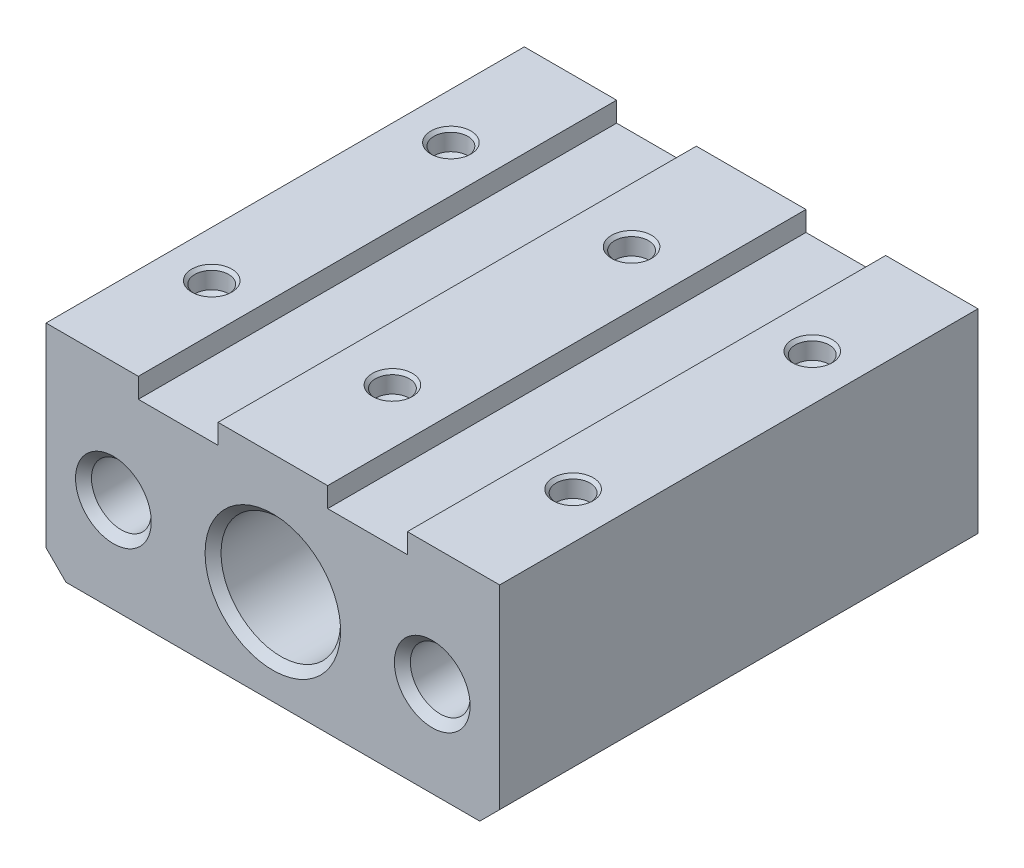
ISO-10303-21;
HEADER;
FILE_DESCRIPTION(('STEP AP214'),'2;1');
FILE_NAME('part.step','',(''),(''),'','','');
FILE_SCHEMA(('AUTOMOTIVE_DESIGN { 1 0 10303 214 1 1 1 1 }'));
ENDSEC;
DATA;
#1=APPLICATION_CONTEXT('core data for automotive mechanical design processes');
#2=APPLICATION_PROTOCOL_DEFINITION('international standard','automotive_design',2000,#1);
#3=PRODUCT_CONTEXT('',#1,'mechanical');
#4=PRODUCT('Part','Part','',(#3));
#5=PRODUCT_RELATED_PRODUCT_CATEGORY('part','',(#4));
#6=PRODUCT_DEFINITION_FORMATION('','',#4);
#7=PRODUCT_DEFINITION_CONTEXT('part definition',#1,'design');
#8=PRODUCT_DEFINITION('design','',#6,#7);
#9=PRODUCT_DEFINITION_SHAPE('','',#8);
#10=(LENGTH_UNIT() NAMED_UNIT(*) SI_UNIT(.MILLI.,.METRE.));
#11=(NAMED_UNIT(*) PLANE_ANGLE_UNIT() SI_UNIT($,.RADIAN.));
#12=(NAMED_UNIT(*) SI_UNIT($,.STERADIAN.) SOLID_ANGLE_UNIT());
#13=UNCERTAINTY_MEASURE_WITH_UNIT(LENGTH_MEASURE(1.E-05),#10,'distance_accuracy_value','');
#14=(GEOMETRIC_REPRESENTATION_CONTEXT(3) GLOBAL_UNCERTAINTY_ASSIGNED_CONTEXT((#13)) GLOBAL_UNIT_ASSIGNED_CONTEXT((#10,
#11,#12)) REPRESENTATION_CONTEXT('',''));
#15=CARTESIAN_POINT('',(0.,0.,0.));
#16=DIRECTION('',(0.,0.,1.));
#17=DIRECTION('',(1.,0.,0.));
#18=AXIS2_PLACEMENT_3D('',#15,#16,#17);
#19=CARTESIAN_POINT('',(56.9089514947405,63.8253093136275,-148.875816897944));
#20=DIRECTION('',(0.,1.,0.));
#21=DIRECTION('',(-1.,0.,0.));
#22=AXIS2_PLACEMENT_3D('',#19,#20,#21);
#23=PLANE('',#22);
#24=CARTESIAN_POINT('',(-45.3294757473701,63.8253093136275,-55.006350416644));
#25=DIRECTION('',(0.,1.,0.));
#26=DIRECTION('',(0.,0.,1.));
#27=AXIS2_PLACEMENT_3D('',#24,#25,#26);
#28=CIRCLE('',#27,5.025);
#29=CARTESIAN_POINT('',(-45.3294757473701,63.8253093136275,-49.981350416644));
#30=VERTEX_POINT('',#29);
#31=EDGE_CURVE('E181',#30,#30,#28,.T.);
#32=ORIENTED_EDGE('',*,*,#31,.F.);
#33=EDGE_LOOP('',(#32));
#34=FACE_BOUND('',#33,.T.);
#35=CARTESIAN_POINT('',(-45.3294757473701,63.8253093136275,4.99364958335603));
#36=DIRECTION('',(0.,1.,0.));
#37=DIRECTION('',(0.,0.,1.));
#38=AXIS2_PLACEMENT_3D('',#35,#36,#37);
#39=CIRCLE('',#38,5.025);
#40=CARTESIAN_POINT('',(-45.3294757473701,63.8253093136275,10.018649583356));
#41=VERTEX_POINT('',#40);
#42=EDGE_CURVE('E174',#41,#41,#39,.T.);
#43=ORIENTED_EDGE('',*,*,#42,.F.);
#44=EDGE_LOOP('',(#43));
#45=FACE_BOUND('',#44,.T.);
#46=DIRECTION('',(0.,0.,1.));
#47=VECTOR('',#46,1.);
#48=CARTESIAN_POINT('',(-33.7499999999997,63.8253093136275,-85.006350416644));
#49=LINE('',#48,#47);
#50=CARTESIAN_POINT('',(-33.7499999999997,63.8253093136275,-85.006350416644));
#51=VERTEX_POINT('',#50);
#52=CARTESIAN_POINT('',(-33.7499999999997,63.8253093136275,34.993649583356));
#53=VERTEX_POINT('',#52);
#54=EDGE_CURVE('E238',#51,#53,#49,.T.);
#55=ORIENTED_EDGE('',*,*,#54,.F.);
#56=DIRECTION('',(1.,0.,0.));
#57=VECTOR('',#56,1.);
#58=CARTESIAN_POINT('',(-192.826831514185,63.8253093136275,-85.006350416644));
#59=LINE('',#58,#57);
#60=CARTESIAN_POINT('',(-56.9089514947403,63.8253093136275,-85.006350416644));
#61=VERTEX_POINT('',#60);
#62=EDGE_CURVE('E293',#61,#51,#59,.T.);
#63=ORIENTED_EDGE('',*,*,#62,.F.);
#64=DIRECTION('',(0.,0.,1.));
#65=VECTOR('',#64,1.);
#66=CARTESIAN_POINT('',(-56.9089514947404,63.8253093136275,-148.875816897944));
#67=LINE('',#66,#65);
#68=CARTESIAN_POINT('',(-56.9089514947404,63.8253093136275,34.993649583356));
#69=VERTEX_POINT('',#68);
#70=EDGE_CURVE('E304',#61,#69,#67,.T.);
#71=ORIENTED_EDGE('',*,*,#70,.T.);
#72=DIRECTION('',(-1.,0.,0.));
#73=VECTOR('',#72,1.);
#74=CARTESIAN_POINT('',(56.9089514947405,63.8253093136275,34.993649583356));
#75=LINE('',#74,#73);
#76=EDGE_CURVE('E292',#53,#69,#75,.T.);
#77=ORIENTED_EDGE('',*,*,#76,.F.);
#78=EDGE_LOOP('',(#55,#63,#71,#77));
#79=FACE_BOUND('',#78,.T.);
#80=ADVANCED_FACE('F43',(#34,#45,#79),#23,.T.);
#81=CARTESIAN_POINT('',(0.,63.8253093136275,4.99364958335602));
#82=DIRECTION('',(0.,1.,0.));
#83=DIRECTION('',(0.,0.,1.));
#84=AXIS2_PLACEMENT_3D('',#81,#82,#83);
#85=CIRCLE('',#84,5.025);
#86=CARTESIAN_POINT('',(0.,63.8253093136275,10.018649583356));
#87=VERTEX_POINT('',#86);
#88=EDGE_CURVE('E190',#87,#87,#85,.T.);
#89=ORIENTED_EDGE('',*,*,#88,.F.);
#90=EDGE_LOOP('',(#89));
#91=FACE_BOUND('',#90,.T.);
#92=CARTESIAN_POINT('',(0.,63.8253093136275,-55.006350416644));
#93=DIRECTION('',(0.,1.,0.));
#94=DIRECTION('',(0.,0.,1.));
#95=AXIS2_PLACEMENT_3D('',#92,#93,#94);
#96=CIRCLE('',#95,5.025);
#97=CARTESIAN_POINT('',(0.,63.8253093136275,-49.981350416644));
#98=VERTEX_POINT('',#97);
#99=EDGE_CURVE('E217',#98,#98,#96,.T.);
#100=ORIENTED_EDGE('',*,*,#99,.F.);
#101=EDGE_LOOP('',(#100));
#102=FACE_BOUND('',#101,.T.);
#103=DIRECTION('',(0.,0.,1.));
#104=VECTOR('',#103,1.);
#105=CARTESIAN_POINT('',(-13.7499999999997,63.8253093136275,-85.006350416644));
#106=LINE('',#105,#104);
#107=CARTESIAN_POINT('',(-13.7499999999997,63.8253093136275,-85.006350416644));
#108=VERTEX_POINT('',#107);
#109=CARTESIAN_POINT('',(-13.7499999999997,63.8253093136275,34.993649583356));
#110=VERTEX_POINT('',#109);
#111=EDGE_CURVE('E241',#108,#110,#106,.T.);
#112=ORIENTED_EDGE('',*,*,#111,.T.);
#113=CARTESIAN_POINT('',(13.7500000000003,63.8253093136275,34.993649583356));
#114=VERTEX_POINT('',#113);
#115=EDGE_CURVE('E303',#114,#110,#75,.T.);
#116=ORIENTED_EDGE('',*,*,#115,.F.);
#117=DIRECTION('',(0.,0.,1.));
#118=VECTOR('',#117,1.);
#119=CARTESIAN_POINT('',(13.7500000000003,63.8253093136275,-85.006350416644));
#120=LINE('',#119,#118);
#121=CARTESIAN_POINT('',(13.7500000000003,63.8253093136275,-85.006350416644));
#122=VERTEX_POINT('',#121);
#123=EDGE_CURVE('E226',#122,#114,#120,.T.);
#124=ORIENTED_EDGE('',*,*,#123,.F.);
#125=EDGE_CURVE('E298',#108,#122,#59,.T.);
#126=ORIENTED_EDGE('',*,*,#125,.F.);
#127=EDGE_LOOP('',(#112,#116,#124,#126));
#128=FACE_BOUND('',#127,.T.);
#129=ADVANCED_FACE('F413',(#91,#102,#128),#23,.T.);
#130=CARTESIAN_POINT('',(-60.2041283154512,30.,34.993649583356));
#131=DIRECTION('',(0.,0.,-1.));
#132=DIRECTION('',(-1.,0.,0.));
#133=AXIS2_PLACEMENT_3D('',#130,#131,#132);
#134=PLANE('',#133);
#135=CARTESIAN_POINT('',(40.0000000000003,33.8253093136275,34.993649583356));
#136=DIRECTION('',(0.,0.,-1.));
#137=DIRECTION('',(-1.,0.,0.));
#138=AXIS2_PLACEMENT_3D('',#135,#136,#137);
#139=CIRCLE('',#138,9.49999999999999);
#140=CARTESIAN_POINT('',(30.5000000000003,33.8253093136275,34.993649583356));
#141=VERTEX_POINT('',#140);
#142=EDGE_CURVE('E336',#141,#141,#139,.T.);
#143=ORIENTED_EDGE('',*,*,#142,.T.);
#144=EDGE_LOOP('',(#143));
#145=FACE_BOUND('',#144,.T.);
#146=CARTESIAN_POINT('',(3.05311331771918E-13,33.8253093136275,34.993649583356));
#147=DIRECTION('',(0.,0.,-1.));
#148=DIRECTION('',(-1.,0.,0.));
#149=AXIS2_PLACEMENT_3D('',#146,#147,#148);
#150=CIRCLE('',#149,17.);
#151=CARTESIAN_POINT('',(-16.9999999999997,33.8253093136275,34.993649583356));
#152=VERTEX_POINT('',#151);
#153=EDGE_CURVE('E333',#152,#152,#150,.T.);
#154=ORIENTED_EDGE('',*,*,#153,.T.);
#155=EDGE_LOOP('',(#154));
#156=FACE_BOUND('',#155,.T.);
#157=CARTESIAN_POINT('',(-39.9999999999997,33.8253093136275,34.993649583356));
#158=DIRECTION('',(0.,0.,-1.));
#159=DIRECTION('',(-1.,0.,0.));
#160=AXIS2_PLACEMENT_3D('',#157,#158,#159);
#161=CIRCLE('',#160,9.49999999999999);
#162=CARTESIAN_POINT('',(-49.4999999999997,33.8253093136275,34.993649583356));
#163=VERTEX_POINT('',#162);
#164=EDGE_CURVE('E330',#163,#163,#161,.T.);
#165=ORIENTED_EDGE('',*,*,#164,.T.);
#166=EDGE_LOOP('',(#165));
#167=FACE_BOUND('',#166,.T.);
#168=DIRECTION('',(1.,0.,0.));
#169=VECTOR('',#168,1.);
#170=CARTESIAN_POINT('',(-60.2041283154512,10.,34.993649583356));
#171=LINE('',#170,#169);
#172=CARTESIAN_POINT('',(-51.9089514947404,10.,34.993649583356));
#173=VERTEX_POINT('',#172);
#174=CARTESIAN_POINT('',(51.9089514947405,10.,34.993649583356));
#175=VERTEX_POINT('',#174);
#176=EDGE_CURVE('E286',#173,#175,#171,.T.);
#177=ORIENTED_EDGE('',*,*,#176,.T.);
#178=DIRECTION('',(-0.707106781186545,-0.70710678118655,0.));
#179=VECTOR('',#178,1.);
#180=CARTESIAN_POINT('',(51.9089514947405,10.,34.993649583356));
#181=LINE('',#180,#179);
#182=CARTESIAN_POINT('',(56.9089514947405,15.,34.993649583356));
#183=VERTEX_POINT('',#182);
#184=EDGE_CURVE('E321',#175,#183,#181,.F.);
#185=ORIENTED_EDGE('',*,*,#184,.T.);
#186=DIRECTION('',(0.,1.,0.));
#187=VECTOR('',#186,1.);
#188=CARTESIAN_POINT('',(56.9089514947405,30.,34.993649583356));
#189=LINE('',#188,#187);
#190=CARTESIAN_POINT('',(56.9089514947405,63.8253093136275,34.993649583356));
#191=VERTEX_POINT('',#190);
#192=EDGE_CURVE('E307',#183,#191,#189,.T.);
#193=ORIENTED_EDGE('',*,*,#192,.T.);
#194=CARTESIAN_POINT('',(33.7500000000003,63.8253093136275,34.993649583356));
#195=VERTEX_POINT('',#194);
#196=EDGE_CURVE('E299',#191,#195,#75,.T.);
#197=ORIENTED_EDGE('',*,*,#196,.T.);
#198=DIRECTION('',(0.,-1.,0.));
#199=VECTOR('',#198,1.);
#200=CARTESIAN_POINT('',(33.7500000000003,30.,34.993649583356));
#201=LINE('',#200,#199);
#202=CARTESIAN_POINT('',(33.7500000000003,58.8253093136275,34.993649583356));
#203=VERTEX_POINT('',#202);
#204=EDGE_CURVE('E269',#195,#203,#201,.T.);
#205=ORIENTED_EDGE('',*,*,#204,.T.);
#206=DIRECTION('',(-1.,0.,0.));
#207=VECTOR('',#206,1.);
#208=CARTESIAN_POINT('',(-60.2041283154512,58.8253093136275,34.993649583356));
#209=LINE('',#208,#207);
#210=CARTESIAN_POINT('',(13.7500000000003,58.8253093136275,34.993649583356));
#211=VERTEX_POINT('',#210);
#212=EDGE_CURVE('E240',#203,#211,#209,.T.);
#213=ORIENTED_EDGE('',*,*,#212,.T.);
#214=DIRECTION('',(0.,1.,0.));
#215=VECTOR('',#214,1.);
#216=CARTESIAN_POINT('',(13.7500000000003,30.,34.993649583356));
#217=LINE('',#216,#215);
#218=EDGE_CURVE('E272',#211,#114,#217,.T.);
#219=ORIENTED_EDGE('',*,*,#218,.T.);
#220=ORIENTED_EDGE('',*,*,#115,.T.);
#221=DIRECTION('',(0.,-1.,0.));
#222=VECTOR('',#221,1.);
#223=CARTESIAN_POINT('',(-13.7499999999997,30.,34.993649583356));
#224=LINE('',#223,#222);
#225=CARTESIAN_POINT('',(-13.7499999999997,58.8253093136275,34.993649583356));
#226=VERTEX_POINT('',#225);
#227=EDGE_CURVE('E278',#110,#226,#224,.T.);
#228=ORIENTED_EDGE('',*,*,#227,.T.);
#229=DIRECTION('',(-1.,0.,0.));
#230=VECTOR('',#229,1.);
#231=CARTESIAN_POINT('',(-60.2041283154512,58.8253093136275,34.993649583356));
#232=LINE('',#231,#230);
#233=CARTESIAN_POINT('',(-33.7499999999997,58.8253093136275,34.993649583356));
#234=VERTEX_POINT('',#233);
#235=EDGE_CURVE('E275',#226,#234,#232,.T.);
#236=ORIENTED_EDGE('',*,*,#235,.T.);
#237=DIRECTION('',(0.,1.,0.));
#238=VECTOR('',#237,1.);
#239=CARTESIAN_POINT('',(-33.7499999999997,30.,34.993649583356));
#240=LINE('',#239,#238);
#241=EDGE_CURVE('E281',#234,#53,#240,.T.);
#242=ORIENTED_EDGE('',*,*,#241,.T.);
#243=ORIENTED_EDGE('',*,*,#76,.T.);
#244=DIRECTION('',(0.,-1.,0.));
#245=VECTOR('',#244,1.);
#246=CARTESIAN_POINT('',(-56.9089514947404,30.,34.993649583356));
#247=LINE('',#246,#245);
#248=CARTESIAN_POINT('',(-56.9089514947404,15.,34.993649583356));
#249=VERTEX_POINT('',#248);
#250=EDGE_CURVE('E311',#69,#249,#247,.T.);
#251=ORIENTED_EDGE('',*,*,#250,.T.);
#252=DIRECTION('',(-0.707106781186549,0.707106781186547,0.));
#253=VECTOR('',#252,1.);
#254=CARTESIAN_POINT('',(-56.9089514947404,15.,34.993649583356));
#255=LINE('',#254,#253);
#256=EDGE_CURVE('E319',#249,#173,#255,.F.);
#257=ORIENTED_EDGE('',*,*,#256,.T.);
#258=EDGE_LOOP('',(#177,#185,#193,#197,#205,#213,#219,#220,#228,#236,#242,#243,#251,#257));
#259=FACE_BOUND('',#258,.T.);
#260=ADVANCED_FACE('F389',(#145,#156,#167,#259),#134,.F.);
#261=CARTESIAN_POINT('',(56.9089514947405,-11.8466243725064,-34.993649583356));
#262=DIRECTION('',(-1.,0.,0.));
#263=DIRECTION('',(0.,-1.,0.));
#264=AXIS2_PLACEMENT_3D('',#261,#262,#263);
#265=PLANE('',#264);
#266=ORIENTED_EDGE('',*,*,#192,.F.);
#267=DIRECTION('',(0.,0.,-1.));
#268=VECTOR('',#267,1.);
#269=CARTESIAN_POINT('',(56.9089514947405,15.,-34.993649583356));
#270=LINE('',#269,#268);
#271=CARTESIAN_POINT('',(56.9089514947405,15.,-85.006350416644));
#272=VERTEX_POINT('',#271);
#273=EDGE_CURVE('E67',#183,#272,#270,.T.);
#274=ORIENTED_EDGE('',*,*,#273,.T.);
#275=DIRECTION('',(0.,1.,0.));
#276=VECTOR('',#275,1.);
#277=CARTESIAN_POINT('',(56.9089514947405,63.8253093136275,-85.006350416644));
#278=LINE('',#277,#276);
#279=CARTESIAN_POINT('',(56.9089514947405,63.8253093136275,-85.006350416644));
#280=VERTEX_POINT('',#279);
#281=EDGE_CURVE('E289',#272,#280,#278,.T.);
#282=ORIENTED_EDGE('',*,*,#281,.T.);
#283=DIRECTION('',(0.,0.,1.));
#284=VECTOR('',#283,1.);
#285=CARTESIAN_POINT('',(56.9089514947405,63.8253093136275,-148.875816897944));
#286=LINE('',#285,#284);
#287=EDGE_CURVE('E302',#280,#191,#286,.T.);
#288=ORIENTED_EDGE('',*,*,#287,.T.);
#289=EDGE_LOOP('',(#266,#274,#282,#288));
#290=FACE_BOUND('',#289,.T.);
#291=ADVANCED_FACE('F425',(#290),#265,.F.);
#292=CARTESIAN_POINT('',(-56.9089514947405,-14.9650471414388,-34.993649583356));
#293=DIRECTION('',(1.,0.,0.));
#294=DIRECTION('',(0.,1.,0.));
#295=AXIS2_PLACEMENT_3D('',#292,#293,#294);
#296=PLANE('',#295);
#297=DIRECTION('',(0.,-1.,0.));
#298=VECTOR('',#297,1.);
#299=CARTESIAN_POINT('',(-56.9089514947403,63.8253093136272,-85.006350416644));
#300=LINE('',#299,#298);
#301=CARTESIAN_POINT('',(-56.9089514947404,15.,-85.006350416644));
#302=VERTEX_POINT('',#301);
#303=EDGE_CURVE('E290',#61,#302,#300,.T.);
#304=ORIENTED_EDGE('',*,*,#303,.T.);
#305=DIRECTION('',(0.,0.,1.));
#306=VECTOR('',#305,1.);
#307=CARTESIAN_POINT('',(-56.9089514947404,15.,-34.993649583356));
#308=LINE('',#307,#306);
#309=EDGE_CURVE('E327',#302,#249,#308,.T.);
#310=ORIENTED_EDGE('',*,*,#309,.T.);
#311=ORIENTED_EDGE('',*,*,#250,.F.);
#312=ORIENTED_EDGE('',*,*,#70,.F.);
#313=EDGE_LOOP('',(#304,#310,#311,#312));
#314=FACE_BOUND('',#313,.T.);
#315=ADVANCED_FACE('F395',(#314),#296,.F.);
#316=CARTESIAN_POINT('',(45.3294757473704,63.8253093136275,4.99364958335601));
#317=DIRECTION('',(0.,1.,0.));
#318=DIRECTION('',(0.,0.,1.));
#319=AXIS2_PLACEMENT_3D('',#316,#317,#318);
#320=CIRCLE('',#319,5.025);
#321=CARTESIAN_POINT('',(45.3294757473704,63.8253093136275,10.018649583356));
#322=VERTEX_POINT('',#321);
#323=EDGE_CURVE('E199',#322,#322,#320,.T.);
#324=ORIENTED_EDGE('',*,*,#323,.F.);
#325=EDGE_LOOP('',(#324));
#326=FACE_BOUND('',#325,.T.);
#327=CARTESIAN_POINT('',(45.3294757473704,63.8253093136275,-55.006350416644));
#328=DIRECTION('',(0.,1.,0.));
#329=DIRECTION('',(0.,0.,1.));
#330=AXIS2_PLACEMENT_3D('',#327,#328,#329);
#331=CIRCLE('',#330,5.025);
#332=CARTESIAN_POINT('',(45.3294757473704,63.8253093136275,-49.981350416644));
#333=VERTEX_POINT('',#332);
#334=EDGE_CURVE('E208',#333,#333,#331,.T.);
#335=ORIENTED_EDGE('',*,*,#334,.F.);
#336=EDGE_LOOP('',(#335));
#337=FACE_BOUND('',#336,.T.);
#338=DIRECTION('',(0.,0.,1.));
#339=VECTOR('',#338,1.);
#340=CARTESIAN_POINT('',(33.7500000000003,63.8253093136275,-85.006350416644));
#341=LINE('',#340,#339);
#342=CARTESIAN_POINT('',(33.7500000000003,63.8253093136275,-85.006350416644));
#343=VERTEX_POINT('',#342);
#344=EDGE_CURVE('E256',#343,#195,#341,.T.);
#345=ORIENTED_EDGE('',*,*,#344,.T.);
#346=ORIENTED_EDGE('',*,*,#196,.F.);
#347=ORIENTED_EDGE('',*,*,#287,.F.);
#348=EDGE_CURVE('E295',#343,#280,#59,.T.);
#349=ORIENTED_EDGE('',*,*,#348,.F.);
#350=EDGE_LOOP('',(#345,#346,#347,#349));
#351=FACE_BOUND('',#350,.T.);
#352=ADVANCED_FACE('F373',(#326,#337,#351),#23,.T.);
#353=CARTESIAN_POINT('',(-192.826831514185,63.8253093136275,-85.006350416644));
#354=DIRECTION('',(0.,0.,-1.));
#355=DIRECTION('',(-1.,0.,0.));
#356=AXIS2_PLACEMENT_3D('',#353,#354,#355);
#357=PLANE('',#356);
#358=CARTESIAN_POINT('',(40.0000000000003,33.8253093136275,-85.006350416644));
#359=DIRECTION('',(0.,0.,-1.));
#360=DIRECTION('',(-1.,0.,0.));
#361=AXIS2_PLACEMENT_3D('',#358,#359,#360);
#362=CIRCLE('',#361,9.49999999999999);
#363=CARTESIAN_POINT('',(30.5000000000003,33.8253093136275,-85.006350416644));
#364=VERTEX_POINT('',#363);
#365=EDGE_CURVE('E351',#364,#364,#362,.F.);
#366=ORIENTED_EDGE('',*,*,#365,.T.);
#367=EDGE_LOOP('',(#366));
#368=FACE_BOUND('',#367,.T.);
#369=CARTESIAN_POINT('',(3.05311331771918E-13,33.8253093136275,-85.006350416644));
#370=DIRECTION('',(0.,0.,-1.));
#371=DIRECTION('',(-1.,0.,0.));
#372=AXIS2_PLACEMENT_3D('',#369,#370,#371);
#373=CIRCLE('',#372,17.);
#374=CARTESIAN_POINT('',(-16.9999999999997,33.8253093136275,-85.006350416644));
#375=VERTEX_POINT('',#374);
#376=EDGE_CURVE('E348',#375,#375,#373,.F.);
#377=ORIENTED_EDGE('',*,*,#376,.T.);
#378=EDGE_LOOP('',(#377));
#379=FACE_BOUND('',#378,.T.);
#380=CARTESIAN_POINT('',(-39.9999999999997,33.8253093136275,-85.006350416644));
#381=DIRECTION('',(0.,0.,-1.));
#382=DIRECTION('',(-1.,0.,0.));
#383=AXIS2_PLACEMENT_3D('',#380,#381,#382);
#384=CIRCLE('',#383,9.49999999999999);
#385=CARTESIAN_POINT('',(-49.4999999999997,33.8253093136275,-85.006350416644));
#386=VERTEX_POINT('',#385);
#387=EDGE_CURVE('E345',#386,#386,#384,.F.);
#388=ORIENTED_EDGE('',*,*,#387,.T.);
#389=EDGE_LOOP('',(#388));
#390=FACE_BOUND('',#389,.T.);
#391=ORIENTED_EDGE('',*,*,#281,.F.);
#392=DIRECTION('',(0.707106781186545,0.70710678118655,0.));
#393=VECTOR('',#392,1.);
#394=CARTESIAN_POINT('',(-43.5462853529079,-85.455236847649,-85.006350416644));
#395=LINE('',#394,#393);
#396=CARTESIAN_POINT('',(51.9089514947405,10.,-85.006350416644));
#397=VERTEX_POINT('',#396);
#398=EDGE_CURVE('E325',#272,#397,#395,.F.);
#399=ORIENTED_EDGE('',*,*,#398,.T.);
#400=DIRECTION('',(-1.,0.,0.));
#401=VECTOR('',#400,1.);
#402=CARTESIAN_POINT('',(-56.9089514947404,10.,-85.006350416644));
#403=LINE('',#402,#401);
#404=CARTESIAN_POINT('',(-51.9089514947404,10.,-85.006350416644));
#405=VERTEX_POINT('',#404);
#406=EDGE_CURVE('E284',#397,#405,#403,.T.);
#407=ORIENTED_EDGE('',*,*,#406,.T.);
#408=DIRECTION('',(0.707106781186549,-0.707106781186547,0.));
#409=VECTOR('',#408,1.);
#410=CARTESIAN_POINT('',(-149.280546161277,107.371594666536,-85.006350416644));
#411=LINE('',#410,#409);
#412=EDGE_CURVE('E59',#405,#302,#411,.F.);
#413=ORIENTED_EDGE('',*,*,#412,.T.);
#414=ORIENTED_EDGE('',*,*,#303,.F.);
#415=ORIENTED_EDGE('',*,*,#62,.T.);
#416=DIRECTION('',(0.,-1.,0.));
#417=VECTOR('',#416,1.);
#418=CARTESIAN_POINT('',(-33.7499999999997,63.8253093136275,-85.006350416644));
#419=LINE('',#418,#417);
#420=CARTESIAN_POINT('',(-33.7499999999997,58.8253093136275,-85.006350416644));
#421=VERTEX_POINT('',#420);
#422=EDGE_CURVE('E227',#51,#421,#419,.T.);
#423=ORIENTED_EDGE('',*,*,#422,.T.);
#424=DIRECTION('',(1.,0.,0.));
#425=VECTOR('',#424,1.);
#426=CARTESIAN_POINT('',(-33.7499999999997,58.8253093136275,-85.006350416644));
#427=LINE('',#426,#425);
#428=CARTESIAN_POINT('',(-13.7499999999997,58.8253093136275,-85.006350416644));
#429=VERTEX_POINT('',#428);
#430=EDGE_CURVE('E230',#421,#429,#427,.T.);
#431=ORIENTED_EDGE('',*,*,#430,.T.);
#432=DIRECTION('',(0.,1.,0.));
#433=VECTOR('',#432,1.);
#434=CARTESIAN_POINT('',(-13.7499999999997,63.8253093136275,-85.006350416644));
#435=LINE('',#434,#433);
#436=EDGE_CURVE('E234',#429,#108,#435,.T.);
#437=ORIENTED_EDGE('',*,*,#436,.T.);
#438=ORIENTED_EDGE('',*,*,#125,.T.);
#439=DIRECTION('',(0.,-1.,0.));
#440=VECTOR('',#439,1.);
#441=CARTESIAN_POINT('',(13.7500000000003,63.8253093136275,-85.006350416644));
#442=LINE('',#441,#440);
#443=CARTESIAN_POINT('',(13.7500000000003,58.8253093136275,-85.006350416644));
#444=VERTEX_POINT('',#443);
#445=EDGE_CURVE('E231',#122,#444,#442,.T.);
#446=ORIENTED_EDGE('',*,*,#445,.T.);
#447=DIRECTION('',(1.,0.,0.));
#448=VECTOR('',#447,1.);
#449=CARTESIAN_POINT('',(13.7500000000003,58.8253093136275,-85.006350416644));
#450=LINE('',#449,#448);
#451=CARTESIAN_POINT('',(33.7500000000003,58.8253093136275,-85.006350416644));
#452=VERTEX_POINT('',#451);
#453=EDGE_CURVE('E262',#444,#452,#450,.T.);
#454=ORIENTED_EDGE('',*,*,#453,.T.);
#455=DIRECTION('',(0.,1.,0.));
#456=VECTOR('',#455,1.);
#457=CARTESIAN_POINT('',(33.7500000000003,63.8253093136275,-85.006350416644));
#458=LINE('',#457,#456);
#459=EDGE_CURVE('E252',#452,#343,#458,.T.);
#460=ORIENTED_EDGE('',*,*,#459,.T.);
#461=ORIENTED_EDGE('',*,*,#348,.T.);
#462=EDGE_LOOP('',(#391,#399,#407,#413,#414,#415,#423,#431,#437,#438,#446,#454,#460,#461));
#463=FACE_BOUND('',#462,.T.);
#464=ADVANCED_FACE('F370',(#368,#379,#390,#463),#357,.T.);
#465=CARTESIAN_POINT('',(3.05311331771918E-13,33.8253093136275,-85.006350416644));
#466=DIRECTION('',(0.,0.,1.));
#467=DIRECTION('',(1.,0.,0.));
#468=AXIS2_PLACEMENT_3D('',#465,#466,#467);
#469=CYLINDRICAL_SURFACE('',#468,15.);
#470=CARTESIAN_POINT('',(3.05311331771918E-13,33.8253093136275,32.993649583356));
#471=DIRECTION('',(0.,0.,-1.));
#472=DIRECTION('',(-1.,0.,0.));
#473=AXIS2_PLACEMENT_3D('',#470,#471,#472);
#474=CIRCLE('',#473,15.);
#475=CARTESIAN_POINT('',(-14.9999999999997,33.8253093136275,32.993649583356));
#476=VERTEX_POINT('',#475);
#477=EDGE_CURVE('E357',#476,#476,#474,.F.);
#478=ORIENTED_EDGE('',*,*,#477,.T.);
#479=EDGE_LOOP('',(#478));
#480=FACE_BOUND('',#479,.T.);
#481=CARTESIAN_POINT('',(3.05311331771918E-13,33.8253093136275,-83.006350416644));
#482=DIRECTION('',(0.,0.,-1.));
#483=DIRECTION('',(-1.,0.,0.));
#484=AXIS2_PLACEMENT_3D('',#481,#482,#483);
#485=CIRCLE('',#484,15.);
#486=CARTESIAN_POINT('',(-14.9999999999997,33.8253093136275,-83.006350416644));
#487=VERTEX_POINT('',#486);
#488=EDGE_CURVE('E354',#487,#487,#485,.T.);
#489=ORIENTED_EDGE('',*,*,#488,.T.);
#490=EDGE_LOOP('',(#489));
#491=FACE_BOUND('',#490,.T.);
#492=ADVANCED_FACE('F372',(#480,#491),#469,.F.);
#493=CARTESIAN_POINT('',(-39.9999999999997,33.8253093136275,-85.006350416644));
#494=DIRECTION('',(0.,0.,1.));
#495=DIRECTION('',(1.,0.,0.));
#496=AXIS2_PLACEMENT_3D('',#493,#494,#495);
#497=CYLINDRICAL_SURFACE('',#496,7.5);
#498=CARTESIAN_POINT('',(-39.9999999999997,33.8253093136275,32.993649583356));
#499=DIRECTION('',(0.,0.,-1.));
#500=DIRECTION('',(-1.,0.,0.));
#501=AXIS2_PLACEMENT_3D('',#498,#499,#500);
#502=CIRCLE('',#501,7.5);
#503=CARTESIAN_POINT('',(-47.4999999999997,33.8253093136275,32.993649583356));
#504=VERTEX_POINT('',#503);
#505=EDGE_CURVE('E11',#504,#504,#502,.F.);
#506=ORIENTED_EDGE('',*,*,#505,.T.);
#507=EDGE_LOOP('',(#506));
#508=FACE_BOUND('',#507,.T.);
#509=CARTESIAN_POINT('',(-39.9999999999997,33.8253093136275,-83.006350416644));
#510=DIRECTION('',(0.,0.,-1.));
#511=DIRECTION('',(-1.,0.,0.));
#512=AXIS2_PLACEMENT_3D('',#509,#510,#511);
#513=CIRCLE('',#512,7.5);
#514=CARTESIAN_POINT('',(-47.4999999999997,33.8253093136275,-83.006350416644));
#515=VERTEX_POINT('',#514);
#516=EDGE_CURVE('E52',#515,#515,#513,.T.);
#517=ORIENTED_EDGE('',*,*,#516,.T.);
#518=EDGE_LOOP('',(#517));
#519=FACE_BOUND('',#518,.T.);
#520=ADVANCED_FACE('F362',(#508,#519),#497,.F.);
#521=CARTESIAN_POINT('',(40.0000000000003,33.8253093136275,-85.006350416644));
#522=DIRECTION('',(0.,0.,1.));
#523=DIRECTION('',(1.,0.,0.));
#524=AXIS2_PLACEMENT_3D('',#521,#522,#523);
#525=CYLINDRICAL_SURFACE('',#524,7.5);
#526=CARTESIAN_POINT('',(40.0000000000003,33.8253093136275,32.993649583356));
#527=DIRECTION('',(0.,0.,-1.));
#528=DIRECTION('',(-1.,0.,0.));
#529=AXIS2_PLACEMENT_3D('',#526,#527,#528);
#530=CIRCLE('',#529,7.5);
#531=CARTESIAN_POINT('',(32.5000000000003,33.8253093136275,32.993649583356));
#532=VERTEX_POINT('',#531);
#533=EDGE_CURVE('E342',#532,#532,#530,.F.);
#534=ORIENTED_EDGE('',*,*,#533,.T.);
#535=EDGE_LOOP('',(#534));
#536=FACE_BOUND('',#535,.T.);
#537=CARTESIAN_POINT('',(40.0000000000003,33.8253093136275,-83.006350416644));
#538=DIRECTION('',(0.,0.,-1.));
#539=DIRECTION('',(-1.,0.,0.));
#540=AXIS2_PLACEMENT_3D('',#537,#538,#539);
#541=CIRCLE('',#540,7.5);
#542=CARTESIAN_POINT('',(32.5000000000003,33.8253093136275,-83.006350416644));
#543=VERTEX_POINT('',#542);
#544=EDGE_CURVE('E339',#543,#543,#541,.T.);
#545=ORIENTED_EDGE('',*,*,#544,.T.);
#546=EDGE_LOOP('',(#545));
#547=FACE_BOUND('',#546,.T.);
#548=ADVANCED_FACE('F499',(#536,#547),#525,.F.);
#549=CARTESIAN_POINT('',(-56.9089514947404,10.,-85.006350416644));
#550=DIRECTION('',(0.,1.,0.));
#551=DIRECTION('',(-1.,0.,0.));
#552=AXIS2_PLACEMENT_3D('',#549,#550,#551);
#553=PLANE('',#552);
#554=ORIENTED_EDGE('',*,*,#406,.F.);
#555=DIRECTION('',(0.,0.,1.));
#556=VECTOR('',#555,1.);
#557=CARTESIAN_POINT('',(51.9089514947405,10.,-85.006350416644));
#558=LINE('',#557,#556);
#559=EDGE_CURVE('E316',#397,#175,#558,.T.);
#560=ORIENTED_EDGE('',*,*,#559,.T.);
#561=ORIENTED_EDGE('',*,*,#176,.F.);
#562=DIRECTION('',(0.,0.,-1.));
#563=VECTOR('',#562,1.);
#564=CARTESIAN_POINT('',(-51.9089514947404,10.,-85.006350416644));
#565=LINE('',#564,#563);
#566=EDGE_CURVE('E314',#173,#405,#565,.T.);
#567=ORIENTED_EDGE('',*,*,#566,.T.);
#568=EDGE_LOOP('',(#554,#560,#561,#567));
#569=FACE_BOUND('',#568,.T.);
#570=ADVANCED_FACE('F386',(#569),#553,.F.);
#571=CARTESIAN_POINT('',(13.7500000000003,63.8253093136275,-85.006350416644));
#572=DIRECTION('',(-1.,0.,0.));
#573=DIRECTION('',(0.,-1.,0.));
#574=AXIS2_PLACEMENT_3D('',#571,#572,#573);
#575=PLANE('',#574);
#576=DIRECTION('',(0.,0.,1.));
#577=VECTOR('',#576,1.);
#578=CARTESIAN_POINT('',(13.7500000000003,58.8253093136275,-85.006350416644));
#579=LINE('',#578,#577);
#580=EDGE_CURVE('E249',#444,#211,#579,.T.);
#581=ORIENTED_EDGE('',*,*,#580,.F.);
#582=ORIENTED_EDGE('',*,*,#445,.F.);
#583=ORIENTED_EDGE('',*,*,#123,.T.);
#584=ORIENTED_EDGE('',*,*,#218,.F.);
#585=EDGE_LOOP('',(#581,#582,#583,#584));
#586=FACE_BOUND('',#585,.T.);
#587=ADVANCED_FACE('F416',(#586),#575,.F.);
#588=CARTESIAN_POINT('',(33.7500000000003,63.8253093136275,-85.006350416644));
#589=DIRECTION('',(1.,0.,0.));
#590=DIRECTION('',(0.,0.,-1.));
#591=AXIS2_PLACEMENT_3D('',#588,#589,#590);
#592=PLANE('',#591);
#593=ORIENTED_EDGE('',*,*,#344,.F.);
#594=ORIENTED_EDGE('',*,*,#459,.F.);
#595=DIRECTION('',(0.,0.,1.));
#596=VECTOR('',#595,1.);
#597=CARTESIAN_POINT('',(33.7500000000003,58.8253093136275,-85.006350416644));
#598=LINE('',#597,#596);
#599=EDGE_CURVE('E253',#452,#203,#598,.T.);
#600=ORIENTED_EDGE('',*,*,#599,.T.);
#601=ORIENTED_EDGE('',*,*,#204,.F.);
#602=EDGE_LOOP('',(#593,#594,#600,#601));
#603=FACE_BOUND('',#602,.T.);
#604=ADVANCED_FACE('F422',(#603),#592,.F.);
#605=CARTESIAN_POINT('',(13.7500000000003,58.8253093136275,-85.006350416644));
#606=DIRECTION('',(0.,-1.,0.));
#607=DIRECTION('',(0.,0.,-1.));
#608=AXIS2_PLACEMENT_3D('',#605,#606,#607);
#609=PLANE('',#608);
#610=ORIENTED_EDGE('',*,*,#599,.F.);
#611=ORIENTED_EDGE('',*,*,#453,.F.);
#612=ORIENTED_EDGE('',*,*,#580,.T.);
#613=ORIENTED_EDGE('',*,*,#212,.F.);
#614=EDGE_LOOP('',(#610,#611,#612,#613));
#615=FACE_BOUND('',#614,.T.);
#616=ADVANCED_FACE('F419',(#615),#609,.F.);
#617=CARTESIAN_POINT('',(-33.7499999999997,63.8253093136275,-85.006350416644));
#618=DIRECTION('',(-1.,0.,0.));
#619=DIRECTION('',(0.,-1.,0.));
#620=AXIS2_PLACEMENT_3D('',#617,#618,#619);
#621=PLANE('',#620);
#622=DIRECTION('',(0.,0.,1.));
#623=VECTOR('',#622,1.);
#624=CARTESIAN_POINT('',(-33.7499999999997,58.8253093136275,-85.006350416644));
#625=LINE('',#624,#623);
#626=EDGE_CURVE('E237',#421,#234,#625,.T.);
#627=ORIENTED_EDGE('',*,*,#626,.F.);
#628=ORIENTED_EDGE('',*,*,#422,.F.);
#629=ORIENTED_EDGE('',*,*,#54,.T.);
#630=ORIENTED_EDGE('',*,*,#241,.F.);
#631=EDGE_LOOP('',(#627,#628,#629,#630));
#632=FACE_BOUND('',#631,.T.);
#633=ADVANCED_FACE('F401',(#632),#621,.F.);
#634=CARTESIAN_POINT('',(-13.7499999999997,63.8253093136275,-85.006350416644));
#635=DIRECTION('',(1.,0.,0.));
#636=DIRECTION('',(0.,0.,-1.));
#637=AXIS2_PLACEMENT_3D('',#634,#635,#636);
#638=PLANE('',#637);
#639=ORIENTED_EDGE('',*,*,#111,.F.);
#640=ORIENTED_EDGE('',*,*,#436,.F.);
#641=DIRECTION('',(0.,0.,1.));
#642=VECTOR('',#641,1.);
#643=CARTESIAN_POINT('',(-13.7499999999997,58.8253093136275,-85.006350416644));
#644=LINE('',#643,#642);
#645=EDGE_CURVE('E244',#429,#226,#644,.T.);
#646=ORIENTED_EDGE('',*,*,#645,.T.);
#647=ORIENTED_EDGE('',*,*,#227,.F.);
#648=EDGE_LOOP('',(#639,#640,#646,#647));
#649=FACE_BOUND('',#648,.T.);
#650=ADVANCED_FACE('F408',(#649),#638,.F.);
#651=CARTESIAN_POINT('',(-33.7499999999997,58.8253093136275,-85.006350416644));
#652=DIRECTION('',(0.,-1.,0.));
#653=DIRECTION('',(0.,0.,-1.));
#654=AXIS2_PLACEMENT_3D('',#651,#652,#653);
#655=PLANE('',#654);
#656=ORIENTED_EDGE('',*,*,#645,.F.);
#657=ORIENTED_EDGE('',*,*,#430,.F.);
#658=ORIENTED_EDGE('',*,*,#626,.T.);
#659=ORIENTED_EDGE('',*,*,#235,.F.);
#660=EDGE_LOOP('',(#656,#657,#658,#659));
#661=FACE_BOUND('',#660,.T.);
#662=ADVANCED_FACE('F405',(#661),#655,.F.);
#663=CARTESIAN_POINT('',(51.9089514947405,10.,-85.006350416644));
#664=DIRECTION('',(-0.70710678118655,0.707106781186545,0.));
#665=DIRECTION('',(0.,0.,1.));
#666=AXIS2_PLACEMENT_3D('',#663,#664,#665);
#667=PLANE('',#666);
#668=ORIENTED_EDGE('',*,*,#398,.F.);
#669=ORIENTED_EDGE('',*,*,#273,.F.);
#670=ORIENTED_EDGE('',*,*,#184,.F.);
#671=ORIENTED_EDGE('',*,*,#559,.F.);
#672=EDGE_LOOP('',(#668,#669,#670,#671));
#673=FACE_BOUND('',#672,.T.);
#674=ADVANCED_FACE('F383',(#673),#667,.F.);
#675=CARTESIAN_POINT('',(-56.9089514947404,15.,-34.993649583356));
#676=DIRECTION('',(0.707106781186547,0.707106781186549,0.));
#677=DIRECTION('',(0.,0.,1.));
#678=AXIS2_PLACEMENT_3D('',#675,#676,#677);
#679=PLANE('',#678);
#680=ORIENTED_EDGE('',*,*,#412,.F.);
#681=ORIENTED_EDGE('',*,*,#566,.F.);
#682=ORIENTED_EDGE('',*,*,#256,.F.);
#683=ORIENTED_EDGE('',*,*,#309,.F.);
#684=EDGE_LOOP('',(#680,#681,#682,#683));
#685=FACE_BOUND('',#684,.T.);
#686=ADVANCED_FACE('F393',(#685),#679,.F.);
#687=CARTESIAN_POINT('',(40.0000000000003,33.8253093136275,34.993649583356));
#688=DIRECTION('',(0.,0.,1.));
#689=DIRECTION('',(1.,0.,0.));
#690=AXIS2_PLACEMENT_3D('',#687,#688,#689);
#691=CONICAL_SURFACE('',#690,9.49999999999999,0.785398163397447);
#692=ORIENTED_EDGE('',*,*,#533,.F.);
#693=EDGE_LOOP('',(#692));
#694=FACE_BOUND('',#693,.T.);
#695=ORIENTED_EDGE('',*,*,#142,.F.);
#696=EDGE_LOOP('',(#695));
#697=FACE_BOUND('',#696,.T.);
#698=ADVANCED_FACE('F547',(#694,#697),#691,.F.);
#699=CARTESIAN_POINT('',(40.0000000000003,33.8253093136275,-85.006350416644));
#700=DIRECTION('',(0.,0.,-1.));
#701=DIRECTION('',(-1.,0.,0.));
#702=AXIS2_PLACEMENT_3D('',#699,#700,#701);
#703=CONICAL_SURFACE('',#702,9.49999999999999,0.785398163397447);
#704=ORIENTED_EDGE('',*,*,#544,.F.);
#705=EDGE_LOOP('',(#704));
#706=FACE_BOUND('',#705,.T.);
#707=ORIENTED_EDGE('',*,*,#365,.F.);
#708=EDGE_LOOP('',(#707));
#709=FACE_BOUND('',#708,.T.);
#710=ADVANCED_FACE('F526',(#706,#709),#703,.F.);
#711=CARTESIAN_POINT('',(3.05311331771918E-13,33.8253093136275,34.993649583356));
#712=DIRECTION('',(0.,0.,1.));
#713=DIRECTION('',(1.,0.,0.));
#714=AXIS2_PLACEMENT_3D('',#711,#712,#713);
#715=CONICAL_SURFACE('',#714,17.,0.785398163397447);
#716=ORIENTED_EDGE('',*,*,#477,.F.);
#717=EDGE_LOOP('',(#716));
#718=FACE_BOUND('',#717,.T.);
#719=ORIENTED_EDGE('',*,*,#153,.F.);
#720=EDGE_LOOP('',(#719));
#721=FACE_BOUND('',#720,.T.);
#722=ADVANCED_FACE('F517',(#718,#721),#715,.F.);
#723=CARTESIAN_POINT('',(3.05311331771918E-13,33.8253093136275,-85.006350416644));
#724=DIRECTION('',(0.,0.,-1.));
#725=DIRECTION('',(-1.,0.,0.));
#726=AXIS2_PLACEMENT_3D('',#723,#724,#725);
#727=CONICAL_SURFACE('',#726,17.,0.785398163397443);
#728=ORIENTED_EDGE('',*,*,#488,.F.);
#729=EDGE_LOOP('',(#728));
#730=FACE_BOUND('',#729,.T.);
#731=ORIENTED_EDGE('',*,*,#376,.F.);
#732=EDGE_LOOP('',(#731));
#733=FACE_BOUND('',#732,.T.);
#734=ADVANCED_FACE('F514',(#730,#733),#727,.F.);
#735=CARTESIAN_POINT('',(-39.9999999999997,33.8253093136275,34.993649583356));
#736=DIRECTION('',(0.,0.,1.));
#737=DIRECTION('',(1.,0.,0.));
#738=AXIS2_PLACEMENT_3D('',#735,#736,#737);
#739=CONICAL_SURFACE('',#738,9.49999999999999,0.785398163397447);
#740=ORIENTED_EDGE('',*,*,#505,.F.);
#741=EDGE_LOOP('',(#740));
#742=FACE_BOUND('',#741,.T.);
#743=ORIENTED_EDGE('',*,*,#164,.F.);
#744=EDGE_LOOP('',(#743));
#745=FACE_BOUND('',#744,.T.);
#746=ADVANCED_FACE('F367',(#742,#745),#739,.F.);
#747=CARTESIAN_POINT('',(-39.9999999999997,33.8253093136275,-85.006350416644));
#748=DIRECTION('',(0.,0.,-1.));
#749=DIRECTION('',(-1.,0.,0.));
#750=AXIS2_PLACEMENT_3D('',#747,#748,#749);
#751=CONICAL_SURFACE('',#750,9.49999999999999,0.785398163397447);
#752=ORIENTED_EDGE('',*,*,#516,.F.);
#753=EDGE_LOOP('',(#752));
#754=FACE_BOUND('',#753,.T.);
#755=ORIENTED_EDGE('',*,*,#387,.F.);
#756=EDGE_LOOP('',(#755));
#757=FACE_BOUND('',#756,.T.);
#758=ADVANCED_FACE('F46',(#754,#757),#751,.F.);
#759=CARTESIAN_POINT('',(0.,58.8253093136275,-55.006350416644));
#760=DIRECTION('',(0.,1.,0.));
#761=DIRECTION('',(0.,0.,1.));
#762=AXIS2_PLACEMENT_3D('',#759,#760,#761);
#763=CONICAL_SURFACE('',#762,4.25,1.02974425867665);
#764=CARTESIAN_POINT('',(0.,56.2716516827603,-55.006350416644));
#765=VERTEX_POINT('',#764);
#766=VERTEX_LOOP('',#765);
#767=FACE_BOUND('',#766,.T.);
#768=CARTESIAN_POINT('',(0.,58.8253093136275,-55.006350416644));
#769=DIRECTION('',(0.,1.,0.));
#770=DIRECTION('',(0.,0.,1.));
#771=AXIS2_PLACEMENT_3D('',#768,#769,#770);
#772=CIRCLE('',#771,4.25);
#773=CARTESIAN_POINT('',(0.,58.8253093136275,-50.756350416644));
#774=VERTEX_POINT('',#773);
#775=EDGE_CURVE('E223',#774,#774,#772,.T.);
#776=ORIENTED_EDGE('',*,*,#775,.T.);
#777=EDGE_LOOP('',(#776));
#778=FACE_BOUND('',#777,.T.);
#779=ADVANCED_FACE('F366',(#767,#778),#763,.F.);
#780=CARTESIAN_POINT('',(0.,63.8253093136275,-55.006350416644));
#781=DIRECTION('',(0.,1.,0.));
#782=DIRECTION('',(0.,0.,1.));
#783=AXIS2_PLACEMENT_3D('',#780,#781,#782);
#784=CYLINDRICAL_SURFACE('',#783,4.25);
#785=ORIENTED_EDGE('',*,*,#775,.F.);
#786=EDGE_LOOP('',(#785));
#787=FACE_BOUND('',#786,.T.);
#788=CARTESIAN_POINT('',(0.,63.0503093136275,-55.006350416644));
#789=DIRECTION('',(0.,1.,0.));
#790=DIRECTION('',(0.,0.,1.));
#791=AXIS2_PLACEMENT_3D('',#788,#789,#790);
#792=CIRCLE('',#791,4.25);
#793=CARTESIAN_POINT('',(0.,63.0503093136275,-50.756350416644));
#794=VERTEX_POINT('',#793);
#795=EDGE_CURVE('E220',#794,#794,#792,.T.);
#796=ORIENTED_EDGE('',*,*,#795,.T.);
#797=EDGE_LOOP('',(#796));
#798=FACE_BOUND('',#797,.T.);
#799=ADVANCED_FACE('F477',(#787,#798),#784,.F.);
#800=CARTESIAN_POINT('',(0.,63.8253093136275,-55.006350416644));
#801=DIRECTION('',(0.,1.,0.));
#802=DIRECTION('',(0.,0.,1.));
#803=AXIS2_PLACEMENT_3D('',#800,#801,#802);
#804=CONICAL_SURFACE('',#803,5.025,0.78539816339745);
#805=ORIENTED_EDGE('',*,*,#795,.F.);
#806=EDGE_LOOP('',(#805));
#807=FACE_BOUND('',#806,.T.);
#808=ORIENTED_EDGE('',*,*,#99,.T.);
#809=EDGE_LOOP('',(#808));
#810=FACE_BOUND('',#809,.T.);
#811=ADVANCED_FACE('F473',(#807,#810),#804,.F.);
#812=CARTESIAN_POINT('',(45.3294757473704,58.8253093136275,-55.006350416644));
#813=DIRECTION('',(0.,1.,0.));
#814=DIRECTION('',(0.,0.,1.));
#815=AXIS2_PLACEMENT_3D('',#812,#813,#814);
#816=CONICAL_SURFACE('',#815,4.25,1.02974425867665);
#817=CARTESIAN_POINT('',(45.3294757473704,56.2716516827604,-55.006350416644));
#818=VERTEX_POINT('',#817);
#819=VERTEX_LOOP('',#818);
#820=FACE_BOUND('',#819,.T.);
#821=CARTESIAN_POINT('',(45.3294757473704,58.8253093136275,-55.006350416644));
#822=DIRECTION('',(0.,1.,0.));
#823=DIRECTION('',(0.,0.,1.));
#824=AXIS2_PLACEMENT_3D('',#821,#822,#823);
#825=CIRCLE('',#824,4.25);
#826=CARTESIAN_POINT('',(45.3294757473704,58.8253093136275,-50.756350416644));
#827=VERTEX_POINT('',#826);
#828=EDGE_CURVE('E214',#827,#827,#825,.T.);
#829=ORIENTED_EDGE('',*,*,#828,.T.);
#830=EDGE_LOOP('',(#829));
#831=FACE_BOUND('',#830,.T.);
#832=ADVANCED_FACE('F465',(#820,#831),#816,.F.);
#833=CARTESIAN_POINT('',(45.3294757473704,63.8253093136275,-55.006350416644));
#834=DIRECTION('',(0.,1.,0.));
#835=DIRECTION('',(0.,0.,1.));
#836=AXIS2_PLACEMENT_3D('',#833,#834,#835);
#837=CYLINDRICAL_SURFACE('',#836,4.25);
#838=ORIENTED_EDGE('',*,*,#828,.F.);
#839=EDGE_LOOP('',(#838));
#840=FACE_BOUND('',#839,.T.);
#841=CARTESIAN_POINT('',(45.3294757473704,63.0503093136275,-55.006350416644));
#842=DIRECTION('',(0.,1.,0.));
#843=DIRECTION('',(0.,0.,1.));
#844=AXIS2_PLACEMENT_3D('',#841,#842,#843);
#845=CIRCLE('',#844,4.25);
#846=CARTESIAN_POINT('',(45.3294757473704,63.0503093136275,-50.756350416644));
#847=VERTEX_POINT('',#846);
#848=EDGE_CURVE('E211',#847,#847,#845,.T.);
#849=ORIENTED_EDGE('',*,*,#848,.T.);
#850=EDGE_LOOP('',(#849));
#851=FACE_BOUND('',#850,.T.);
#852=ADVANCED_FACE('F455',(#840,#851),#837,.F.);
#853=CARTESIAN_POINT('',(45.3294757473704,63.8253093136275,-55.006350416644));
#854=DIRECTION('',(0.,1.,0.));
#855=DIRECTION('',(0.,0.,1.));
#856=AXIS2_PLACEMENT_3D('',#853,#854,#855);
#857=CONICAL_SURFACE('',#856,5.025,0.785398163397453);
#858=ORIENTED_EDGE('',*,*,#848,.F.);
#859=EDGE_LOOP('',(#858));
#860=FACE_BOUND('',#859,.T.);
#861=ORIENTED_EDGE('',*,*,#334,.T.);
#862=EDGE_LOOP('',(#861));
#863=FACE_BOUND('',#862,.T.);
#864=ADVANCED_FACE('F452',(#860,#863),#857,.F.);
#865=CARTESIAN_POINT('',(45.3294757473704,58.8253093136275,4.99364958335601));
#866=DIRECTION('',(0.,1.,0.));
#867=DIRECTION('',(0.,0.,1.));
#868=AXIS2_PLACEMENT_3D('',#865,#866,#867);
#869=CONICAL_SURFACE('',#868,4.25,1.02974425867665);
#870=CARTESIAN_POINT('',(45.3294757473704,56.2716516827604,4.99364958335601));
#871=VERTEX_POINT('',#870);
#872=VERTEX_LOOP('',#871);
#873=FACE_BOUND('',#872,.T.);
#874=CARTESIAN_POINT('',(45.3294757473704,58.8253093136275,4.99364958335601));
#875=DIRECTION('',(0.,1.,0.));
#876=DIRECTION('',(0.,0.,1.));
#877=AXIS2_PLACEMENT_3D('',#874,#875,#876);
#878=CIRCLE('',#877,4.25);
#879=CARTESIAN_POINT('',(45.3294757473704,58.8253093136275,9.24364958335601));
#880=VERTEX_POINT('',#879);
#881=EDGE_CURVE('E205',#880,#880,#878,.T.);
#882=ORIENTED_EDGE('',*,*,#881,.T.);
#883=EDGE_LOOP('',(#882));
#884=FACE_BOUND('',#883,.T.);
#885=ADVANCED_FACE('F454',(#873,#884),#869,.F.);
#886=CARTESIAN_POINT('',(45.3294757473704,63.8253093136275,4.99364958335601));
#887=DIRECTION('',(0.,1.,0.));
#888=DIRECTION('',(0.,0.,1.));
#889=AXIS2_PLACEMENT_3D('',#886,#887,#888);
#890=CYLINDRICAL_SURFACE('',#889,4.25);
#891=ORIENTED_EDGE('',*,*,#881,.F.);
#892=EDGE_LOOP('',(#891));
#893=FACE_BOUND('',#892,.T.);
#894=CARTESIAN_POINT('',(45.3294757473704,63.0503093136275,4.99364958335601));
#895=DIRECTION('',(0.,1.,0.));
#896=DIRECTION('',(0.,0.,1.));
#897=AXIS2_PLACEMENT_3D('',#894,#895,#896);
#898=CIRCLE('',#897,4.25);
#899=CARTESIAN_POINT('',(45.3294757473704,63.0503093136275,9.24364958335601));
#900=VERTEX_POINT('',#899);
#901=EDGE_CURVE('E202',#900,#900,#898,.T.);
#902=ORIENTED_EDGE('',*,*,#901,.T.);
#903=EDGE_LOOP('',(#902));
#904=FACE_BOUND('',#903,.T.);
#905=ADVANCED_FACE('F462',(#893,#904),#890,.F.);
#906=CARTESIAN_POINT('',(45.3294757473704,63.8253093136275,4.99364958335601));
#907=DIRECTION('',(0.,1.,0.));
#908=DIRECTION('',(0.,0.,1.));
#909=AXIS2_PLACEMENT_3D('',#906,#907,#908);
#910=CONICAL_SURFACE('',#909,5.025,0.785398163397453);
#911=ORIENTED_EDGE('',*,*,#901,.F.);
#912=EDGE_LOOP('',(#911));
#913=FACE_BOUND('',#912,.T.);
#914=ORIENTED_EDGE('',*,*,#323,.T.);
#915=EDGE_LOOP('',(#914));
#916=FACE_BOUND('',#915,.T.);
#917=ADVANCED_FACE('F686',(#913,#916),#910,.F.);
#918=CARTESIAN_POINT('',(0.,58.8253093136275,4.99364958335602));
#919=DIRECTION('',(0.,1.,0.));
#920=DIRECTION('',(0.,0.,1.));
#921=AXIS2_PLACEMENT_3D('',#918,#919,#920);
#922=CONICAL_SURFACE('',#921,4.25,1.02974425867665);
#923=CARTESIAN_POINT('',(0.,56.2716516827603,4.99364958335602));
#924=VERTEX_POINT('',#923);
#925=VERTEX_LOOP('',#924);
#926=FACE_BOUND('',#925,.T.);
#927=CARTESIAN_POINT('',(0.,58.8253093136275,4.99364958335602));
#928=DIRECTION('',(0.,1.,0.));
#929=DIRECTION('',(0.,0.,1.));
#930=AXIS2_PLACEMENT_3D('',#927,#928,#929);
#931=CIRCLE('',#930,4.25);
#932=CARTESIAN_POINT('',(0.,58.8253093136275,9.24364958335602));
#933=VERTEX_POINT('',#932);
#934=EDGE_CURVE('E196',#933,#933,#931,.T.);
#935=ORIENTED_EDGE('',*,*,#934,.T.);
#936=EDGE_LOOP('',(#935));
#937=FACE_BOUND('',#936,.T.);
#938=ADVANCED_FACE('F697',(#926,#937),#922,.F.);
#939=CARTESIAN_POINT('',(0.,63.8253093136275,4.99364958335602));
#940=DIRECTION('',(0.,1.,0.));
#941=DIRECTION('',(0.,0.,1.));
#942=AXIS2_PLACEMENT_3D('',#939,#940,#941);
#943=CYLINDRICAL_SURFACE('',#942,4.25);
#944=ORIENTED_EDGE('',*,*,#934,.F.);
#945=EDGE_LOOP('',(#944));
#946=FACE_BOUND('',#945,.T.);
#947=CARTESIAN_POINT('',(0.,63.0503093136275,4.99364958335602));
#948=DIRECTION('',(0.,1.,0.));
#949=DIRECTION('',(0.,0.,1.));
#950=AXIS2_PLACEMENT_3D('',#947,#948,#949);
#951=CIRCLE('',#950,4.25);
#952=CARTESIAN_POINT('',(0.,63.0503093136275,9.24364958335602));
#953=VERTEX_POINT('',#952);
#954=EDGE_CURVE('E193',#953,#953,#951,.T.);
#955=ORIENTED_EDGE('',*,*,#954,.T.);
#956=EDGE_LOOP('',(#955));
#957=FACE_BOUND('',#956,.T.);
#958=ADVANCED_FACE('F708',(#946,#957),#943,.F.);
#959=CARTESIAN_POINT('',(0.,63.8253093136275,4.99364958335602));
#960=DIRECTION('',(0.,1.,0.));
#961=DIRECTION('',(0.,0.,1.));
#962=AXIS2_PLACEMENT_3D('',#959,#960,#961);
#963=CONICAL_SURFACE('',#962,5.025,0.78539816339745);
#964=ORIENTED_EDGE('',*,*,#954,.F.);
#965=EDGE_LOOP('',(#964));
#966=FACE_BOUND('',#965,.T.);
#967=ORIENTED_EDGE('',*,*,#88,.T.);
#968=EDGE_LOOP('',(#967));
#969=FACE_BOUND('',#968,.T.);
#970=ADVANCED_FACE('F719',(#966,#969),#963,.F.);
#971=CARTESIAN_POINT('',(-45.3294757473701,58.8253093136275,4.99364958335603));
#972=DIRECTION('',(0.,1.,0.));
#973=DIRECTION('',(0.,0.,1.));
#974=AXIS2_PLACEMENT_3D('',#971,#972,#973);
#975=CONICAL_SURFACE('',#974,4.25,1.02974425867665);
#976=CARTESIAN_POINT('',(-45.3294757473701,56.2716516827603,4.99364958335603));
#977=VERTEX_POINT('',#976);
#978=VERTEX_LOOP('',#977);
#979=FACE_BOUND('',#978,.T.);
#980=CARTESIAN_POINT('',(-45.3294757473701,58.8253093136275,4.99364958335603));
#981=DIRECTION('',(0.,1.,0.));
#982=DIRECTION('',(0.,0.,1.));
#983=AXIS2_PLACEMENT_3D('',#980,#981,#982);
#984=CIRCLE('',#983,4.25);
#985=CARTESIAN_POINT('',(-45.3294757473701,58.8253093136275,9.24364958335602));
#986=VERTEX_POINT('',#985);
#987=EDGE_CURVE('E187',#986,#986,#984,.T.);
#988=ORIENTED_EDGE('',*,*,#987,.T.);
#989=EDGE_LOOP('',(#988));
#990=FACE_BOUND('',#989,.T.);
#991=ADVANCED_FACE('F731',(#979,#990),#975,.F.);
#992=CARTESIAN_POINT('',(-45.3294757473701,63.8253093136275,4.99364958335603));
#993=DIRECTION('',(0.,1.,0.));
#994=DIRECTION('',(0.,0.,1.));
#995=AXIS2_PLACEMENT_3D('',#992,#993,#994);
#996=CYLINDRICAL_SURFACE('',#995,4.25);
#997=ORIENTED_EDGE('',*,*,#987,.F.);
#998=EDGE_LOOP('',(#997));
#999=FACE_BOUND('',#998,.T.);
#1000=CARTESIAN_POINT('',(-45.3294757473701,63.0503093136275,4.99364958335603));
#1001=DIRECTION('',(0.,1.,0.));
#1002=DIRECTION('',(0.,0.,1.));
#1003=AXIS2_PLACEMENT_3D('',#1000,#1001,#1002);
#1004=CIRCLE('',#1003,4.25);
#1005=CARTESIAN_POINT('',(-45.3294757473701,63.0503093136275,9.24364958335602));
#1006=VERTEX_POINT('',#1005);
#1007=EDGE_CURVE('E178',#1006,#1006,#1004,.T.);
#1008=ORIENTED_EDGE('',*,*,#1007,.T.);
#1009=EDGE_LOOP('',(#1008));
#1010=FACE_BOUND('',#1009,.T.);
#1011=ADVANCED_FACE('F742',(#999,#1010),#996,.F.);
#1012=CARTESIAN_POINT('',(-45.3294757473701,63.8253093136275,4.99364958335603));
#1013=DIRECTION('',(0.,1.,0.));
#1014=DIRECTION('',(0.,0.,1.));
#1015=AXIS2_PLACEMENT_3D('',#1012,#1013,#1014);
#1016=CONICAL_SURFACE('',#1015,5.025,0.785398163397453);
#1017=ORIENTED_EDGE('',*,*,#1007,.F.);
#1018=EDGE_LOOP('',(#1017));
#1019=FACE_BOUND('',#1018,.T.);
#1020=ORIENTED_EDGE('',*,*,#42,.T.);
#1021=EDGE_LOOP('',(#1020));
#1022=FACE_BOUND('',#1021,.T.);
#1023=ADVANCED_FACE('F168',(#1019,#1022),#1016,.F.);
#1024=CARTESIAN_POINT('',(-45.3294757473701,58.8253093136275,-55.006350416644));
#1025=DIRECTION('',(0.,1.,0.));
#1026=DIRECTION('',(0.,0.,1.));
#1027=AXIS2_PLACEMENT_3D('',#1024,#1025,#1026);
#1028=CONICAL_SURFACE('',#1027,4.25,1.02974425867665);
#1029=CARTESIAN_POINT('',(-45.3294757473701,56.2716516827603,-55.006350416644));
#1030=VERTEX_POINT('',#1029);
#1031=VERTEX_LOOP('',#1030);
#1032=FACE_BOUND('',#1031,.T.);
#1033=CARTESIAN_POINT('',(-45.3294757473701,58.8253093136275,-55.006350416644));
#1034=DIRECTION('',(0.,1.,0.));
#1035=DIRECTION('',(0.,0.,1.));
#1036=AXIS2_PLACEMENT_3D('',#1033,#1034,#1035);
#1037=CIRCLE('',#1036,4.25);
#1038=CARTESIAN_POINT('',(-45.3294757473701,58.8253093136275,-50.756350416644));
#1039=VERTEX_POINT('',#1038);
#1040=EDGE_CURVE('E172',#1039,#1039,#1037,.T.);
#1041=ORIENTED_EDGE('',*,*,#1040,.T.);
#1042=EDGE_LOOP('',(#1041));
#1043=FACE_BOUND('',#1042,.T.);
#1044=ADVANCED_FACE('F164',(#1032,#1043),#1028,.F.);
#1045=CARTESIAN_POINT('',(-45.3294757473701,63.8253093136275,-55.006350416644));
#1046=DIRECTION('',(0.,1.,0.));
#1047=DIRECTION('',(0.,0.,1.));
#1048=AXIS2_PLACEMENT_3D('',#1045,#1046,#1047);
#1049=CYLINDRICAL_SURFACE('',#1048,4.25);
#1050=ORIENTED_EDGE('',*,*,#1040,.F.);
#1051=EDGE_LOOP('',(#1050));
#1052=FACE_BOUND('',#1051,.T.);
#1053=CARTESIAN_POINT('',(-45.3294757473701,63.0503093136275,-55.006350416644));
#1054=DIRECTION('',(0.,1.,0.));
#1055=DIRECTION('',(0.,0.,1.));
#1056=AXIS2_PLACEMENT_3D('',#1053,#1054,#1055);
#1057=CIRCLE('',#1056,4.25);
#1058=CARTESIAN_POINT('',(-45.3294757473701,63.0503093136275,-50.756350416644));
#1059=VERTEX_POINT('',#1058);
#1060=EDGE_CURVE('E175',#1059,#1059,#1057,.T.);
#1061=ORIENTED_EDGE('',*,*,#1060,.T.);
#1062=EDGE_LOOP('',(#1061));
#1063=FACE_BOUND('',#1062,.T.);
#1064=ADVANCED_FACE('F167',(#1052,#1063),#1049,.F.);
#1065=CARTESIAN_POINT('',(-45.3294757473701,63.8253093136275,-55.006350416644));
#1066=DIRECTION('',(0.,1.,0.));
#1067=DIRECTION('',(0.,0.,1.));
#1068=AXIS2_PLACEMENT_3D('',#1065,#1066,#1067);
#1069=CONICAL_SURFACE('',#1068,5.025,0.785398163397453);
#1070=ORIENTED_EDGE('',*,*,#1060,.F.);
#1071=EDGE_LOOP('',(#1070));
#1072=FACE_BOUND('',#1071,.T.);
#1073=ORIENTED_EDGE('',*,*,#31,.T.);
#1074=EDGE_LOOP('',(#1073));
#1075=FACE_BOUND('',#1074,.T.);
#1076=ADVANCED_FACE('F781',(#1072,#1075),#1069,.F.);
#1077=CLOSED_SHELL('',(#80,#129,#260,#291,#315,#352,#464,#492,#520,#548,#570,#587,#604,#616,
#633,#650,#662,#674,#686,#698,#710,#722,#734,#746,#758,#779,#799,#811,#832,#852,#864,#885,#905,
#917,#938,#958,#970,#991,#1011,#1023,#1044,#1064,#1076));
#1078=MANIFOLD_SOLID_BREP('B2',#1077);
#1079=ADVANCED_BREP_SHAPE_REPRESENTATION('',(#18,#1078),#14);
#1080=SHAPE_DEFINITION_REPRESENTATION(#9,#1079);
ENDSEC;
END-ISO-10303-21;
